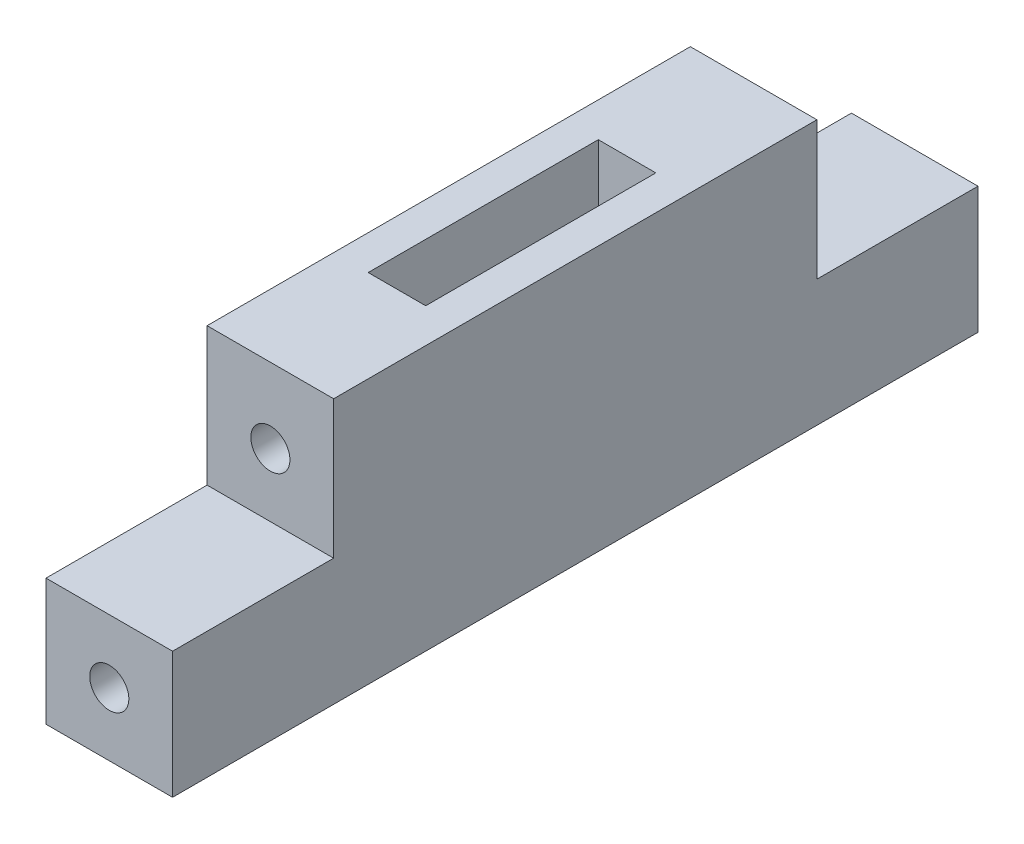
ISO-10303-21;
HEADER;
FILE_DESCRIPTION(('STEP AP214'),'2;1');
FILE_NAME('part.step','',(''),(''),'','','');
FILE_SCHEMA(('AUTOMOTIVE_DESIGN { 1 0 10303 214 1 1 1 1 }'));
ENDSEC;
DATA;
#1=APPLICATION_CONTEXT('core data for automotive mechanical design processes');
#2=APPLICATION_PROTOCOL_DEFINITION('international standard','automotive_design',2000,#1);
#3=PRODUCT_CONTEXT('',#1,'mechanical');
#4=PRODUCT('Part','Part','',(#3));
#5=PRODUCT_RELATED_PRODUCT_CATEGORY('part','',(#4));
#6=PRODUCT_DEFINITION_FORMATION('','',#4);
#7=PRODUCT_DEFINITION_CONTEXT('part definition',#1,'design');
#8=PRODUCT_DEFINITION('design','',#6,#7);
#9=PRODUCT_DEFINITION_SHAPE('','',#8);
#10=(LENGTH_UNIT() NAMED_UNIT(*) SI_UNIT(.MILLI.,.METRE.));
#11=(NAMED_UNIT(*) PLANE_ANGLE_UNIT() SI_UNIT($,.RADIAN.));
#12=(NAMED_UNIT(*) SI_UNIT($,.STERADIAN.) SOLID_ANGLE_UNIT());
#13=UNCERTAINTY_MEASURE_WITH_UNIT(LENGTH_MEASURE(1.E-05),#10,'distance_accuracy_value','');
#14=(GEOMETRIC_REPRESENTATION_CONTEXT(3) GLOBAL_UNCERTAINTY_ASSIGNED_CONTEXT((#13)) GLOBAL_UNIT_ASSIGNED_CONTEXT((#10,
#11,#12)) REPRESENTATION_CONTEXT('',''));
#15=CARTESIAN_POINT('',(0.,0.,0.));
#16=DIRECTION('',(0.,0.,1.));
#17=DIRECTION('',(1.,0.,0.));
#18=AXIS2_PLACEMENT_3D('',#15,#16,#17);
#19=CARTESIAN_POINT('',(0.,11.,85.5563491861041));
#20=DIRECTION('',(0.,-1.,0.));
#21=DIRECTION('',(1.,0.,0.));
#22=AXIS2_PLACEMENT_3D('',#19,#20,#21);
#23=PLANE('',#22);
#24=DIRECTION('',(-1.,0.,0.));
#25=VECTOR('',#24,1.);
#26=CARTESIAN_POINT('',(0.,11.,14.));
#27=LINE('',#26,#25);
#28=CARTESIAN_POINT('',(11.,11.,14.));
#29=VERTEX_POINT('',#28);
#30=CARTESIAN_POINT('',(0.,11.,14.));
#31=VERTEX_POINT('',#30);
#32=EDGE_CURVE('E295',#29,#31,#27,.T.);
#33=ORIENTED_EDGE('',*,*,#32,.F.);
#34=DIRECTION('',(0.,0.,-1.));
#35=VECTOR('',#34,1.);
#36=CARTESIAN_POINT('',(11.,11.,85.5563491861041));
#37=LINE('',#36,#35);
#38=CARTESIAN_POINT('',(11.,11.,0.));
#39=VERTEX_POINT('',#38);
#40=EDGE_CURVE('E356',#29,#39,#37,.T.);
#41=ORIENTED_EDGE('',*,*,#40,.T.);
#42=DIRECTION('',(-1.,0.,0.));
#43=VECTOR('',#42,1.);
#44=CARTESIAN_POINT('',(0.,11.,0.));
#45=LINE('',#44,#43);
#46=CARTESIAN_POINT('',(0.,11.,0.));
#47=VERTEX_POINT('',#46);
#48=EDGE_CURVE('E373',#39,#47,#45,.T.);
#49=ORIENTED_EDGE('',*,*,#48,.T.);
#50=DIRECTION('',(0.,0.,-1.));
#51=VECTOR('',#50,1.);
#52=CARTESIAN_POINT('',(0.,11.,85.5563491861041));
#53=LINE('',#52,#51);
#54=EDGE_CURVE('E369',#31,#47,#53,.T.);
#55=ORIENTED_EDGE('',*,*,#54,.F.);
#56=EDGE_LOOP('',(#33,#41,#49,#55));
#57=FACE_BOUND('',#56,.T.);
#58=ADVANCED_FACE('F37',(#57),#23,.F.);
#59=DIRECTION('',(1.,0.,0.));
#60=VECTOR('',#59,1.);
#61=CARTESIAN_POINT('',(0.,11.,56.));
#62=LINE('',#61,#60);
#63=CARTESIAN_POINT('',(0.,11.,56.));
#64=VERTEX_POINT('',#63);
#65=CARTESIAN_POINT('',(11.,11.,56.));
#66=VERTEX_POINT('',#65);
#67=EDGE_CURVE('E381',#64,#66,#62,.T.);
#68=ORIENTED_EDGE('',*,*,#67,.F.);
#69=CARTESIAN_POINT('',(0.,11.,70.));
#70=VERTEX_POINT('',#69);
#71=EDGE_CURVE('E361',#70,#64,#53,.T.);
#72=ORIENTED_EDGE('',*,*,#71,.F.);
#73=DIRECTION('',(1.,0.,0.));
#74=VECTOR('',#73,1.);
#75=CARTESIAN_POINT('',(0.,11.,70.));
#76=LINE('',#75,#74);
#77=CARTESIAN_POINT('',(11.,11.,70.));
#78=VERTEX_POINT('',#77);
#79=EDGE_CURVE('E344',#70,#78,#76,.T.);
#80=ORIENTED_EDGE('',*,*,#79,.T.);
#81=EDGE_CURVE('E350',#78,#66,#37,.T.);
#82=ORIENTED_EDGE('',*,*,#81,.T.);
#83=EDGE_LOOP('',(#68,#72,#80,#82));
#84=FACE_BOUND('',#83,.T.);
#85=ADVANCED_FACE('F359',(#84),#23,.F.);
#86=CARTESIAN_POINT('',(0.,0.,0.));
#87=DIRECTION('',(0.,0.,-1.));
#88=DIRECTION('',(-1.,0.,0.));
#89=AXIS2_PLACEMENT_3D('',#86,#87,#88);
#90=PLANE('',#89);
#91=CARTESIAN_POINT('',(5.5,5.5,0.));
#92=DIRECTION('',(0.,0.,-1.));
#93=DIRECTION('',(-1.,0.,0.));
#94=AXIS2_PLACEMENT_3D('',#91,#92,#93);
#95=CIRCLE('',#94,1.7);
#96=CARTESIAN_POINT('',(3.8,5.5,0.));
#97=VERTEX_POINT('',#96);
#98=EDGE_CURVE('E316',#97,#97,#95,.T.);
#99=ORIENTED_EDGE('',*,*,#98,.F.);
#100=EDGE_LOOP('',(#99));
#101=FACE_BOUND('',#100,.T.);
#102=DIRECTION('',(0.,-1.,0.));
#103=VECTOR('',#102,1.);
#104=CARTESIAN_POINT('',(0.,0.,0.));
#105=LINE('',#104,#103);
#106=CARTESIAN_POINT('',(0.,0.,0.));
#107=VERTEX_POINT('',#106);
#108=EDGE_CURVE('E414',#47,#107,#105,.T.);
#109=ORIENTED_EDGE('',*,*,#108,.F.);
#110=ORIENTED_EDGE('',*,*,#48,.F.);
#111=DIRECTION('',(0.,1.,0.));
#112=VECTOR('',#111,1.);
#113=CARTESIAN_POINT('',(11.,0.,0.));
#114=LINE('',#113,#112);
#115=CARTESIAN_POINT('',(11.,0.,0.));
#116=VERTEX_POINT('',#115);
#117=EDGE_CURVE('E406',#116,#39,#114,.T.);
#118=ORIENTED_EDGE('',*,*,#117,.F.);
#119=DIRECTION('',(1.,0.,0.));
#120=VECTOR('',#119,1.);
#121=CARTESIAN_POINT('',(0.,0.,0.));
#122=LINE('',#121,#120);
#123=EDGE_CURVE('E411',#107,#116,#122,.T.);
#124=ORIENTED_EDGE('',*,*,#123,.F.);
#125=EDGE_LOOP('',(#109,#110,#118,#124));
#126=FACE_BOUND('',#125,.T.);
#127=ADVANCED_FACE('F413',(#101,#126),#90,.T.);
#128=CARTESIAN_POINT('',(11.,0.,85.5563491861041));
#129=DIRECTION('',(-1.,0.,0.));
#130=DIRECTION('',(0.,0.,1.));
#131=AXIS2_PLACEMENT_3D('',#128,#129,#130);
#132=PLANE('',#131);
#133=ORIENTED_EDGE('',*,*,#81,.F.);
#134=DIRECTION('',(0.,-1.,0.));
#135=VECTOR('',#134,1.);
#136=CARTESIAN_POINT('',(11.,0.,70.));
#137=LINE('',#136,#135);
#138=CARTESIAN_POINT('',(11.,0.,70.));
#139=VERTEX_POINT('',#138);
#140=EDGE_CURVE('E341',#78,#139,#137,.T.);
#141=ORIENTED_EDGE('',*,*,#140,.T.);
#142=DIRECTION('',(0.,0.,-1.));
#143=VECTOR('',#142,1.);
#144=CARTESIAN_POINT('',(11.,0.,85.5563491861041));
#145=LINE('',#144,#143);
#146=EDGE_CURVE('E355',#139,#116,#145,.T.);
#147=ORIENTED_EDGE('',*,*,#146,.T.);
#148=ORIENTED_EDGE('',*,*,#117,.T.);
#149=ORIENTED_EDGE('',*,*,#40,.F.);
#150=DIRECTION('',(0.,-1.,0.));
#151=VECTOR('',#150,1.);
#152=CARTESIAN_POINT('',(11.0000000000001,66.4165866921848,14.));
#153=LINE('',#152,#151);
#154=CARTESIAN_POINT('',(11.,22.9999999999999,14.));
#155=VERTEX_POINT('',#154);
#156=EDGE_CURVE('E300',#155,#29,#153,.T.);
#157=ORIENTED_EDGE('',*,*,#156,.F.);
#158=DIRECTION('',(0.,0.,-1.));
#159=VECTOR('',#158,1.);
#160=CARTESIAN_POINT('',(11.,22.9999999999999,14.0000000000001));
#161=LINE('',#160,#159);
#162=CARTESIAN_POINT('',(11.,23.,56.));
#163=VERTEX_POINT('',#162);
#164=EDGE_CURVE('E415',#163,#155,#161,.T.);
#165=ORIENTED_EDGE('',*,*,#164,.F.);
#166=DIRECTION('',(0.,-1.,0.));
#167=VECTOR('',#166,1.);
#168=CARTESIAN_POINT('',(11.0000000000001,66.4165866921848,56.));
#169=LINE('',#168,#167);
#170=EDGE_CURVE('E305',#163,#66,#169,.T.);
#171=ORIENTED_EDGE('',*,*,#170,.T.);
#172=EDGE_LOOP('',(#133,#141,#147,#148,#149,#157,#165,#171));
#173=FACE_BOUND('',#172,.T.);
#174=ADVANCED_FACE('F351',(#173),#132,.F.);
#175=CARTESIAN_POINT('',(0.,0.,85.5563491861041));
#176=DIRECTION('',(0.,1.,0.));
#177=DIRECTION('',(0.,0.,1.));
#178=AXIS2_PLACEMENT_3D('',#175,#176,#177);
#179=PLANE('',#178);
#180=DIRECTION('',(1.,0.,0.));
#181=VECTOR('',#180,1.);
#182=CARTESIAN_POINT('',(3.,0.,14.));
#183=LINE('',#182,#181);
#184=CARTESIAN_POINT('',(3.,0.,14.));
#185=VERTEX_POINT('',#184);
#186=CARTESIAN_POINT('',(7.99999999999999,0.,14.));
#187=VERTEX_POINT('',#186);
#188=EDGE_CURVE('E208',#185,#187,#183,.T.);
#189=ORIENTED_EDGE('',*,*,#188,.F.);
#190=DIRECTION('',(0.,0.,-1.));
#191=VECTOR('',#190,1.);
#192=CARTESIAN_POINT('',(3.,0.,14.));
#193=LINE('',#192,#191);
#194=CARTESIAN_POINT('',(3.,0.,16.));
#195=VERTEX_POINT('',#194);
#196=EDGE_CURVE('E54',#195,#185,#193,.T.);
#197=ORIENTED_EDGE('',*,*,#196,.F.);
#198=DIRECTION('',(-1.,0.,0.));
#199=VECTOR('',#198,1.);
#200=CARTESIAN_POINT('',(3.,0.,16.));
#201=LINE('',#200,#199);
#202=CARTESIAN_POINT('',(7.99999999999999,0.,16.));
#203=VERTEX_POINT('',#202);
#204=EDGE_CURVE('E196',#203,#195,#201,.T.);
#205=ORIENTED_EDGE('',*,*,#204,.F.);
#206=DIRECTION('',(0.,0.,1.));
#207=VECTOR('',#206,1.);
#208=CARTESIAN_POINT('',(7.99999999999999,0.,14.));
#209=LINE('',#208,#207);
#210=EDGE_CURVE('E199',#187,#203,#209,.T.);
#211=ORIENTED_EDGE('',*,*,#210,.F.);
#212=EDGE_LOOP('',(#189,#197,#205,#211));
#213=FACE_BOUND('',#212,.T.);
#214=DIRECTION('',(1.,0.,0.));
#215=VECTOR('',#214,1.);
#216=CARTESIAN_POINT('',(2.99999999999999,0.,54.));
#217=LINE('',#216,#215);
#218=CARTESIAN_POINT('',(2.99999999999999,0.,54.));
#219=VERTEX_POINT('',#218);
#220=CARTESIAN_POINT('',(7.99999999999999,0.,54.));
#221=VERTEX_POINT('',#220);
#222=EDGE_CURVE('E232',#219,#221,#217,.T.);
#223=ORIENTED_EDGE('',*,*,#222,.F.);
#224=DIRECTION('',(0.,0.,-1.));
#225=VECTOR('',#224,1.);
#226=CARTESIAN_POINT('',(2.99999999999999,0.,56.));
#227=LINE('',#226,#225);
#228=CARTESIAN_POINT('',(2.99999999999999,0.,56.));
#229=VERTEX_POINT('',#228);
#230=EDGE_CURVE('E62',#229,#219,#227,.T.);
#231=ORIENTED_EDGE('',*,*,#230,.F.);
#232=DIRECTION('',(-1.,0.,0.));
#233=VECTOR('',#232,1.);
#234=CARTESIAN_POINT('',(2.99999999999999,0.,56.));
#235=LINE('',#234,#233);
#236=CARTESIAN_POINT('',(7.99999999999999,0.,56.));
#237=VERTEX_POINT('',#236);
#238=EDGE_CURVE('E221',#237,#229,#235,.T.);
#239=ORIENTED_EDGE('',*,*,#238,.F.);
#240=DIRECTION('',(0.,0.,1.));
#241=VECTOR('',#240,1.);
#242=CARTESIAN_POINT('',(7.99999999999999,0.,56.));
#243=LINE('',#242,#241);
#244=EDGE_CURVE('E235',#221,#237,#243,.T.);
#245=ORIENTED_EDGE('',*,*,#244,.F.);
#246=EDGE_LOOP('',(#223,#231,#239,#245));
#247=FACE_BOUND('',#246,.T.);
#248=ORIENTED_EDGE('',*,*,#146,.F.);
#249=DIRECTION('',(-1.,0.,0.));
#250=VECTOR('',#249,1.);
#251=CARTESIAN_POINT('',(0.,0.,70.));
#252=LINE('',#251,#250);
#253=CARTESIAN_POINT('',(0.,0.,70.));
#254=VERTEX_POINT('',#253);
#255=EDGE_CURVE('E46',#139,#254,#252,.T.);
#256=ORIENTED_EDGE('',*,*,#255,.T.);
#257=DIRECTION('',(0.,0.,-1.));
#258=VECTOR('',#257,1.);
#259=CARTESIAN_POINT('',(0.,0.,85.5563491861041));
#260=LINE('',#259,#258);
#261=EDGE_CURVE('E362',#254,#107,#260,.T.);
#262=ORIENTED_EDGE('',*,*,#261,.T.);
#263=ORIENTED_EDGE('',*,*,#123,.T.);
#264=EDGE_LOOP('',(#248,#256,#262,#263));
#265=FACE_BOUND('',#264,.T.);
#266=ADVANCED_FACE('F429',(#213,#247,#265),#179,.F.);
#267=CARTESIAN_POINT('',(0.,0.,85.5563491861041));
#268=DIRECTION('',(1.,0.,0.));
#269=DIRECTION('',(0.,0.,-1.));
#270=AXIS2_PLACEMENT_3D('',#267,#268,#269);
#271=PLANE('',#270);
#272=ORIENTED_EDGE('',*,*,#261,.F.);
#273=DIRECTION('',(0.,1.,0.));
#274=VECTOR('',#273,1.);
#275=CARTESIAN_POINT('',(0.,0.,70.));
#276=LINE('',#275,#274);
#277=EDGE_CURVE('E13',#254,#70,#276,.T.);
#278=ORIENTED_EDGE('',*,*,#277,.T.);
#279=ORIENTED_EDGE('',*,*,#71,.T.);
#280=DIRECTION('',(0.,-1.,0.));
#281=VECTOR('',#280,1.);
#282=CARTESIAN_POINT('',(0.,66.4165866921848,56.));
#283=LINE('',#282,#281);
#284=CARTESIAN_POINT('',(0.,23.,56.));
#285=VERTEX_POINT('',#284);
#286=EDGE_CURVE('E385',#285,#64,#283,.T.);
#287=ORIENTED_EDGE('',*,*,#286,.F.);
#288=DIRECTION('',(0.,0.,1.));
#289=VECTOR('',#288,1.);
#290=CARTESIAN_POINT('',(0.,22.9999999999999,14.0000000000001));
#291=LINE('',#290,#289);
#292=CARTESIAN_POINT('',(0.,22.9999999999999,14.));
#293=VERTEX_POINT('',#292);
#294=EDGE_CURVE('E397',#293,#285,#291,.T.);
#295=ORIENTED_EDGE('',*,*,#294,.F.);
#296=DIRECTION('',(0.,-1.,0.));
#297=VECTOR('',#296,1.);
#298=CARTESIAN_POINT('',(0.,66.4165866921848,14.));
#299=LINE('',#298,#297);
#300=EDGE_CURVE('E283',#293,#31,#299,.T.);
#301=ORIENTED_EDGE('',*,*,#300,.T.);
#302=ORIENTED_EDGE('',*,*,#54,.T.);
#303=ORIENTED_EDGE('',*,*,#108,.T.);
#304=EDGE_LOOP('',(#272,#278,#279,#287,#295,#301,#302,#303));
#305=FACE_BOUND('',#304,.T.);
#306=ADVANCED_FACE('F39',(#305),#271,.F.);
#307=CARTESIAN_POINT('',(0.,31.0464772466386,70.));
#308=DIRECTION('',(0.,0.,-1.));
#309=DIRECTION('',(-1.,0.,0.));
#310=AXIS2_PLACEMENT_3D('',#307,#308,#309);
#311=PLANE('',#310);
#312=CARTESIAN_POINT('',(5.5,5.5,70.));
#313=DIRECTION('',(0.,0.,1.));
#314=DIRECTION('',(1.,0.,0.));
#315=AXIS2_PLACEMENT_3D('',#312,#313,#314);
#316=CIRCLE('',#315,1.7);
#317=CARTESIAN_POINT('',(7.2,5.5,70.));
#318=VERTEX_POINT('',#317);
#319=EDGE_CURVE('E328',#318,#318,#316,.T.);
#320=ORIENTED_EDGE('',*,*,#319,.F.);
#321=EDGE_LOOP('',(#320));
#322=FACE_BOUND('',#321,.T.);
#323=ORIENTED_EDGE('',*,*,#140,.F.);
#324=ORIENTED_EDGE('',*,*,#79,.F.);
#325=ORIENTED_EDGE('',*,*,#277,.F.);
#326=ORIENTED_EDGE('',*,*,#255,.F.);
#327=EDGE_LOOP('',(#323,#324,#325,#326));
#328=FACE_BOUND('',#327,.T.);
#329=ADVANCED_FACE('F335',(#322,#328),#311,.F.);
#330=CARTESIAN_POINT('',(0.,66.4165866921848,56.));
#331=DIRECTION('',(0.,0.,-1.));
#332=DIRECTION('',(-1.,0.,0.));
#333=AXIS2_PLACEMENT_3D('',#330,#331,#332);
#334=PLANE('',#333);
#335=CARTESIAN_POINT('',(5.49999999999999,16.5,56.));
#336=DIRECTION('',(0.,0.,-1.));
#337=DIRECTION('',(-1.,0.,0.));
#338=AXIS2_PLACEMENT_3D('',#335,#336,#337);
#339=CIRCLE('',#338,1.7);
#340=CARTESIAN_POINT('',(3.79999999999999,16.5,56.));
#341=VERTEX_POINT('',#340);
#342=EDGE_CURVE('E250',#341,#341,#339,.F.);
#343=ORIENTED_EDGE('',*,*,#342,.F.);
#344=EDGE_LOOP('',(#343));
#345=FACE_BOUND('',#344,.T.);
#346=DIRECTION('',(1.,0.,0.));
#347=VECTOR('',#346,1.);
#348=CARTESIAN_POINT('',(0.,23.,56.));
#349=LINE('',#348,#347);
#350=EDGE_CURVE('E419',#285,#163,#349,.T.);
#351=ORIENTED_EDGE('',*,*,#350,.F.);
#352=ORIENTED_EDGE('',*,*,#286,.T.);
#353=ORIENTED_EDGE('',*,*,#67,.T.);
#354=ORIENTED_EDGE('',*,*,#170,.F.);
#355=EDGE_LOOP('',(#351,#352,#353,#354));
#356=FACE_BOUND('',#355,.T.);
#357=ADVANCED_FACE('F338',(#345,#356),#334,.F.);
#358=CARTESIAN_POINT('',(0.,66.4165866921848,14.));
#359=DIRECTION('',(0.,0.,1.));
#360=DIRECTION('',(1.,0.,0.));
#361=AXIS2_PLACEMENT_3D('',#358,#359,#360);
#362=PLANE('',#361);
#363=CARTESIAN_POINT('',(5.5,16.5,14.));
#364=DIRECTION('',(0.,0.,-1.));
#365=DIRECTION('',(-1.,0.,0.));
#366=AXIS2_PLACEMENT_3D('',#363,#364,#365);
#367=CIRCLE('',#366,1.7);
#368=CARTESIAN_POINT('',(3.8,16.5,14.));
#369=VERTEX_POINT('',#368);
#370=EDGE_CURVE('E242',#369,#369,#367,.T.);
#371=ORIENTED_EDGE('',*,*,#370,.F.);
#372=EDGE_LOOP('',(#371));
#373=FACE_BOUND('',#372,.T.);
#374=DIRECTION('',(-1.,0.,0.));
#375=VECTOR('',#374,1.);
#376=CARTESIAN_POINT('',(0.,22.9999999999999,14.));
#377=LINE('',#376,#375);
#378=EDGE_CURVE('E299',#155,#293,#377,.T.);
#379=ORIENTED_EDGE('',*,*,#378,.F.);
#380=ORIENTED_EDGE('',*,*,#156,.T.);
#381=ORIENTED_EDGE('',*,*,#32,.T.);
#382=ORIENTED_EDGE('',*,*,#300,.F.);
#383=EDGE_LOOP('',(#379,#380,#381,#382));
#384=FACE_BOUND('',#383,.T.);
#385=ADVANCED_FACE('F401',(#373,#384),#362,.F.);
#386=CARTESIAN_POINT('',(-23.2214772466387,22.9999999999999,14.));
#387=DIRECTION('',(0.,1.,0.));
#388=DIRECTION('',(0.,0.,-1.));
#389=AXIS2_PLACEMENT_3D('',#386,#387,#388);
#390=PLANE('',#389);
#391=DIRECTION('',(0.,0.,-1.));
#392=VECTOR('',#391,1.);
#393=CARTESIAN_POINT('',(7.99999999999999,22.9999999999999,25.));
#394=LINE('',#393,#392);
#395=CARTESIAN_POINT('',(8.,23.,45.));
#396=VERTEX_POINT('',#395);
#397=CARTESIAN_POINT('',(7.99999999999999,22.9999999999999,25.));
#398=VERTEX_POINT('',#397);
#399=EDGE_CURVE('E257',#396,#398,#394,.T.);
#400=ORIENTED_EDGE('',*,*,#399,.F.);
#401=DIRECTION('',(1.,0.,0.));
#402=VECTOR('',#401,1.);
#403=CARTESIAN_POINT('',(8.,23.,45.));
#404=LINE('',#403,#402);
#405=CARTESIAN_POINT('',(3.,23.,45.));
#406=VERTEX_POINT('',#405);
#407=EDGE_CURVE('E262',#406,#396,#404,.T.);
#408=ORIENTED_EDGE('',*,*,#407,.F.);
#409=DIRECTION('',(0.,0.,1.));
#410=VECTOR('',#409,1.);
#411=CARTESIAN_POINT('',(3.,22.9999999999999,25.));
#412=LINE('',#411,#410);
#413=CARTESIAN_POINT('',(3.,22.9999999999999,25.));
#414=VERTEX_POINT('',#413);
#415=EDGE_CURVE('E276',#414,#406,#412,.T.);
#416=ORIENTED_EDGE('',*,*,#415,.F.);
#417=DIRECTION('',(-1.,0.,0.));
#418=VECTOR('',#417,1.);
#419=CARTESIAN_POINT('',(7.99999999999999,22.9999999999999,25.));
#420=LINE('',#419,#418);
#421=EDGE_CURVE('E273',#398,#414,#420,.T.);
#422=ORIENTED_EDGE('',*,*,#421,.F.);
#423=EDGE_LOOP('',(#400,#408,#416,#422));
#424=FACE_BOUND('',#423,.T.);
#425=ORIENTED_EDGE('',*,*,#378,.T.);
#426=ORIENTED_EDGE('',*,*,#294,.T.);
#427=ORIENTED_EDGE('',*,*,#350,.T.);
#428=ORIENTED_EDGE('',*,*,#164,.T.);
#429=EDGE_LOOP('',(#425,#426,#427,#428));
#430=FACE_BOUND('',#429,.T.);
#431=ADVANCED_FACE('F426',(#424,#430),#390,.T.);
#432=CARTESIAN_POINT('',(7.99999999999999,12.9999999999999,25.));
#433=DIRECTION('',(1.,0.,0.));
#434=DIRECTION('',(0.,1.,0.));
#435=AXIS2_PLACEMENT_3D('',#432,#433,#434);
#436=PLANE('',#435);
#437=ORIENTED_EDGE('',*,*,#399,.T.);
#438=DIRECTION('',(0.,1.,0.));
#439=VECTOR('',#438,1.);
#440=CARTESIAN_POINT('',(7.99999999999999,12.9999999999999,25.));
#441=LINE('',#440,#439);
#442=CARTESIAN_POINT('',(7.99999999999999,12.9999999999999,25.));
#443=VERTEX_POINT('',#442);
#444=EDGE_CURVE('E271',#443,#398,#441,.T.);
#445=ORIENTED_EDGE('',*,*,#444,.F.);
#446=DIRECTION('',(0.,0.,-1.));
#447=VECTOR('',#446,1.);
#448=CARTESIAN_POINT('',(7.99999999999999,12.9999999999999,25.));
#449=LINE('',#448,#447);
#450=CARTESIAN_POINT('',(7.99999999999999,13.,45.));
#451=VERTEX_POINT('',#450);
#452=EDGE_CURVE('E258',#451,#443,#449,.T.);
#453=ORIENTED_EDGE('',*,*,#452,.F.);
#454=DIRECTION('',(0.,1.,0.));
#455=VECTOR('',#454,1.);
#456=CARTESIAN_POINT('',(7.99999999999999,13.,45.));
#457=LINE('',#456,#455);
#458=EDGE_CURVE('E281',#451,#396,#457,.T.);
#459=ORIENTED_EDGE('',*,*,#458,.T.);
#460=EDGE_LOOP('',(#437,#445,#453,#459));
#461=FACE_BOUND('',#460,.T.);
#462=ADVANCED_FACE('F449',(#461),#436,.F.);
#463=CARTESIAN_POINT('',(7.99999999999999,13.,45.));
#464=DIRECTION('',(0.,0.,1.));
#465=DIRECTION('',(0.,-1.,0.));
#466=AXIS2_PLACEMENT_3D('',#463,#464,#465);
#467=PLANE('',#466);
#468=CARTESIAN_POINT('',(5.49999999999999,16.5,45.));
#469=DIRECTION('',(0.,0.,1.));
#470=DIRECTION('',(0.,-1.,0.));
#471=AXIS2_PLACEMENT_3D('',#468,#469,#470);
#472=CIRCLE('',#471,1.7);
#473=CARTESIAN_POINT('',(5.49999999999999,14.8,45.));
#474=VERTEX_POINT('',#473);
#475=EDGE_CURVE('E254',#474,#474,#472,.T.);
#476=ORIENTED_EDGE('',*,*,#475,.T.);
#477=EDGE_LOOP('',(#476));
#478=FACE_BOUND('',#477,.T.);
#479=ORIENTED_EDGE('',*,*,#407,.T.);
#480=ORIENTED_EDGE('',*,*,#458,.F.);
#481=DIRECTION('',(1.,0.,0.));
#482=VECTOR('',#481,1.);
#483=CARTESIAN_POINT('',(7.99999999999999,13.,45.));
#484=LINE('',#483,#482);
#485=CARTESIAN_POINT('',(3.,13.,45.));
#486=VERTEX_POINT('',#485);
#487=EDGE_CURVE('E268',#486,#451,#484,.T.);
#488=ORIENTED_EDGE('',*,*,#487,.F.);
#489=DIRECTION('',(0.,1.,0.));
#490=VECTOR('',#489,1.);
#491=CARTESIAN_POINT('',(3.,13.,45.));
#492=LINE('',#491,#490);
#493=EDGE_CURVE('E284',#486,#406,#492,.T.);
#494=ORIENTED_EDGE('',*,*,#493,.T.);
#495=EDGE_LOOP('',(#479,#480,#488,#494));
#496=FACE_BOUND('',#495,.T.);
#497=ADVANCED_FACE('F459',(#478,#496),#467,.F.);
#498=CARTESIAN_POINT('',(3.,12.9999999999999,25.));
#499=DIRECTION('',(-1.,0.,0.));
#500=DIRECTION('',(0.,0.,1.));
#501=AXIS2_PLACEMENT_3D('',#498,#499,#500);
#502=PLANE('',#501);
#503=ORIENTED_EDGE('',*,*,#415,.T.);
#504=ORIENTED_EDGE('',*,*,#493,.F.);
#505=DIRECTION('',(0.,0.,1.));
#506=VECTOR('',#505,1.);
#507=CARTESIAN_POINT('',(3.,12.9999999999999,25.));
#508=LINE('',#507,#506);
#509=CARTESIAN_POINT('',(3.,12.9999999999999,25.));
#510=VERTEX_POINT('',#509);
#511=EDGE_CURVE('E265',#510,#486,#508,.T.);
#512=ORIENTED_EDGE('',*,*,#511,.F.);
#513=DIRECTION('',(0.,1.,0.));
#514=VECTOR('',#513,1.);
#515=CARTESIAN_POINT('',(3.,12.9999999999999,25.));
#516=LINE('',#515,#514);
#517=EDGE_CURVE('E286',#510,#414,#516,.T.);
#518=ORIENTED_EDGE('',*,*,#517,.T.);
#519=EDGE_LOOP('',(#503,#504,#512,#518));
#520=FACE_BOUND('',#519,.T.);
#521=ADVANCED_FACE('F465',(#520),#502,.F.);
#522=CARTESIAN_POINT('',(7.99999999999999,12.9999999999999,25.));
#523=DIRECTION('',(0.,0.,-1.));
#524=DIRECTION('',(0.,1.,0.));
#525=AXIS2_PLACEMENT_3D('',#522,#523,#524);
#526=PLANE('',#525);
#527=CARTESIAN_POINT('',(5.49999999999999,16.5,25.));
#528=DIRECTION('',(0.,0.,-1.));
#529=DIRECTION('',(0.,1.,0.));
#530=AXIS2_PLACEMENT_3D('',#527,#528,#529);
#531=CIRCLE('',#530,1.7);
#532=CARTESIAN_POINT('',(5.49999999999999,18.2,25.));
#533=VERTEX_POINT('',#532);
#534=EDGE_CURVE('E253',#533,#533,#531,.T.);
#535=ORIENTED_EDGE('',*,*,#534,.T.);
#536=EDGE_LOOP('',(#535));
#537=FACE_BOUND('',#536,.T.);
#538=ORIENTED_EDGE('',*,*,#421,.T.);
#539=ORIENTED_EDGE('',*,*,#517,.F.);
#540=DIRECTION('',(-1.,0.,0.));
#541=VECTOR('',#540,1.);
#542=CARTESIAN_POINT('',(7.99999999999999,12.9999999999999,25.));
#543=LINE('',#542,#541);
#544=EDGE_CURVE('E261',#443,#510,#543,.T.);
#545=ORIENTED_EDGE('',*,*,#544,.F.);
#546=ORIENTED_EDGE('',*,*,#444,.T.);
#547=EDGE_LOOP('',(#538,#539,#545,#546));
#548=FACE_BOUND('',#547,.T.);
#549=ADVANCED_FACE('F461',(#537,#548),#526,.F.);
#550=CARTESIAN_POINT('',(0.,12.9999999999999,0.));
#551=DIRECTION('',(0.,-1.,0.));
#552=DIRECTION('',(0.,0.,-1.));
#553=AXIS2_PLACEMENT_3D('',#550,#551,#552);
#554=PLANE('',#553);
#555=ORIENTED_EDGE('',*,*,#452,.T.);
#556=ORIENTED_EDGE('',*,*,#544,.T.);
#557=ORIENTED_EDGE('',*,*,#511,.T.);
#558=ORIENTED_EDGE('',*,*,#487,.T.);
#559=EDGE_LOOP('',(#555,#556,#557,#558));
#560=FACE_BOUND('',#559,.T.);
#561=ADVANCED_FACE('F464',(#560),#554,.F.);
#562=CARTESIAN_POINT('',(5.49999999999999,16.5,60.8083261120685));
#563=DIRECTION('',(0.,0.,-1.));
#564=DIRECTION('',(-1.,0.,0.));
#565=AXIS2_PLACEMENT_3D('',#562,#563,#564);
#566=CYLINDRICAL_SURFACE('',#565,1.7);
#567=ORIENTED_EDGE('',*,*,#370,.T.);
#568=EDGE_LOOP('',(#567));
#569=FACE_BOUND('',#568,.T.);
#570=ORIENTED_EDGE('',*,*,#534,.F.);
#571=EDGE_LOOP('',(#570));
#572=FACE_BOUND('',#571,.T.);
#573=ADVANCED_FACE('F475',(#569,#572),#566,.F.);
#574=ORIENTED_EDGE('',*,*,#342,.T.);
#575=EDGE_LOOP('',(#574));
#576=FACE_BOUND('',#575,.T.);
#577=ORIENTED_EDGE('',*,*,#475,.F.);
#578=EDGE_LOOP('',(#577));
#579=FACE_BOUND('',#578,.T.);
#580=ADVANCED_FACE('F477',(#576,#579),#566,.F.);
#581=CARTESIAN_POINT('',(2.99999999999999,8.,56.));
#582=DIRECTION('',(-1.,0.,0.));
#583=DIRECTION('',(0.,0.,1.));
#584=AXIS2_PLACEMENT_3D('',#581,#582,#583);
#585=PLANE('',#584);
#586=ORIENTED_EDGE('',*,*,#230,.T.);
#587=DIRECTION('',(0.,-1.,0.));
#588=VECTOR('',#587,1.);
#589=CARTESIAN_POINT('',(2.99999999999999,8.,54.));
#590=LINE('',#589,#588);
#591=CARTESIAN_POINT('',(2.99999999999999,8.,54.));
#592=VERTEX_POINT('',#591);
#593=EDGE_CURVE('E230',#592,#219,#590,.T.);
#594=ORIENTED_EDGE('',*,*,#593,.F.);
#595=DIRECTION('',(0.,0.,-1.));
#596=VECTOR('',#595,1.);
#597=CARTESIAN_POINT('',(2.99999999999999,8.,56.));
#598=LINE('',#597,#596);
#599=CARTESIAN_POINT('',(2.99999999999999,8.,56.));
#600=VERTEX_POINT('',#599);
#601=EDGE_CURVE('E217',#600,#592,#598,.T.);
#602=ORIENTED_EDGE('',*,*,#601,.F.);
#603=DIRECTION('',(0.,-1.,0.));
#604=VECTOR('',#603,1.);
#605=CARTESIAN_POINT('',(2.99999999999999,8.,56.));
#606=LINE('',#605,#604);
#607=EDGE_CURVE('E240',#600,#229,#606,.T.);
#608=ORIENTED_EDGE('',*,*,#607,.T.);
#609=EDGE_LOOP('',(#586,#594,#602,#608));
#610=FACE_BOUND('',#609,.T.);
#611=ADVANCED_FACE('F480',(#610),#585,.F.);
#612=CARTESIAN_POINT('',(2.99999999999999,8.,56.));
#613=DIRECTION('',(0.,0.,1.));
#614=DIRECTION('',(1.,0.,0.));
#615=AXIS2_PLACEMENT_3D('',#612,#613,#614);
#616=PLANE('',#615);
#617=CARTESIAN_POINT('',(5.5,5.5,56.));
#618=DIRECTION('',(0.,0.,1.));
#619=DIRECTION('',(1.,0.,0.));
#620=AXIS2_PLACEMENT_3D('',#617,#618,#619);
#621=CIRCLE('',#620,1.7);
#622=CARTESIAN_POINT('',(7.2,5.5,56.));
#623=VERTEX_POINT('',#622);
#624=EDGE_CURVE('E320',#623,#623,#621,.T.);
#625=ORIENTED_EDGE('',*,*,#624,.T.);
#626=EDGE_LOOP('',(#625));
#627=FACE_BOUND('',#626,.T.);
#628=ORIENTED_EDGE('',*,*,#238,.T.);
#629=ORIENTED_EDGE('',*,*,#607,.F.);
#630=DIRECTION('',(-1.,0.,0.));
#631=VECTOR('',#630,1.);
#632=CARTESIAN_POINT('',(2.99999999999999,8.,56.));
#633=LINE('',#632,#631);
#634=CARTESIAN_POINT('',(7.99999999999999,8.,56.));
#635=VERTEX_POINT('',#634);
#636=EDGE_CURVE('E227',#635,#600,#633,.T.);
#637=ORIENTED_EDGE('',*,*,#636,.F.);
#638=DIRECTION('',(0.,-1.,0.));
#639=VECTOR('',#638,1.);
#640=CARTESIAN_POINT('',(7.99999999999999,8.,56.));
#641=LINE('',#640,#639);
#642=EDGE_CURVE('E243',#635,#237,#641,.T.);
#643=ORIENTED_EDGE('',*,*,#642,.T.);
#644=EDGE_LOOP('',(#628,#629,#637,#643));
#645=FACE_BOUND('',#644,.T.);
#646=ADVANCED_FACE('F484',(#627,#645),#616,.F.);
#647=CARTESIAN_POINT('',(7.99999999999999,8.,56.));
#648=DIRECTION('',(1.,0.,0.));
#649=DIRECTION('',(0.,0.,-1.));
#650=AXIS2_PLACEMENT_3D('',#647,#648,#649);
#651=PLANE('',#650);
#652=ORIENTED_EDGE('',*,*,#244,.T.);
#653=ORIENTED_EDGE('',*,*,#642,.F.);
#654=DIRECTION('',(0.,0.,1.));
#655=VECTOR('',#654,1.);
#656=CARTESIAN_POINT('',(7.99999999999999,8.,56.));
#657=LINE('',#656,#655);
#658=CARTESIAN_POINT('',(7.99999999999999,8.,54.));
#659=VERTEX_POINT('',#658);
#660=EDGE_CURVE('E224',#659,#635,#657,.T.);
#661=ORIENTED_EDGE('',*,*,#660,.F.);
#662=DIRECTION('',(0.,-1.,0.));
#663=VECTOR('',#662,1.);
#664=CARTESIAN_POINT('',(7.99999999999999,8.,54.));
#665=LINE('',#664,#663);
#666=EDGE_CURVE('E245',#659,#221,#665,.T.);
#667=ORIENTED_EDGE('',*,*,#666,.T.);
#668=EDGE_LOOP('',(#652,#653,#661,#667));
#669=FACE_BOUND('',#668,.T.);
#670=ADVANCED_FACE('F489',(#669),#651,.F.);
#671=CARTESIAN_POINT('',(2.99999999999999,8.,54.));
#672=DIRECTION('',(0.,0.,-1.));
#673=DIRECTION('',(-1.,0.,0.));
#674=AXIS2_PLACEMENT_3D('',#671,#672,#673);
#675=PLANE('',#674);
#676=CARTESIAN_POINT('',(5.5,5.5,54.));
#677=DIRECTION('',(0.,0.,-1.));
#678=DIRECTION('',(-1.,0.,0.));
#679=AXIS2_PLACEMENT_3D('',#676,#677,#678);
#680=CIRCLE('',#679,1.7);
#681=CARTESIAN_POINT('',(7.2,5.5,54.));
#682=VERTEX_POINT('',#681);
#683=EDGE_CURVE('E41',#682,#682,#680,.T.);
#684=ORIENTED_EDGE('',*,*,#683,.T.);
#685=EDGE_LOOP('',(#684));
#686=FACE_BOUND('',#685,.T.);
#687=ORIENTED_EDGE('',*,*,#222,.T.);
#688=ORIENTED_EDGE('',*,*,#666,.F.);
#689=DIRECTION('',(1.,0.,0.));
#690=VECTOR('',#689,1.);
#691=CARTESIAN_POINT('',(2.99999999999999,8.,54.));
#692=LINE('',#691,#690);
#693=EDGE_CURVE('E220',#592,#659,#692,.T.);
#694=ORIENTED_EDGE('',*,*,#693,.F.);
#695=ORIENTED_EDGE('',*,*,#593,.T.);
#696=EDGE_LOOP('',(#687,#688,#694,#695));
#697=FACE_BOUND('',#696,.T.);
#698=ADVANCED_FACE('F485',(#686,#697),#675,.F.);
#699=CARTESIAN_POINT('',(0.,8.,0.));
#700=DIRECTION('',(0.,-1.,0.));
#701=DIRECTION('',(0.,0.,-1.));
#702=AXIS2_PLACEMENT_3D('',#699,#700,#701);
#703=PLANE('',#702);
#704=ORIENTED_EDGE('',*,*,#601,.T.);
#705=ORIENTED_EDGE('',*,*,#693,.T.);
#706=ORIENTED_EDGE('',*,*,#660,.T.);
#707=ORIENTED_EDGE('',*,*,#636,.T.);
#708=EDGE_LOOP('',(#704,#705,#706,#707));
#709=FACE_BOUND('',#708,.T.);
#710=ADVANCED_FACE('F488',(#709),#703,.T.);
#711=CARTESIAN_POINT('',(3.,8.,14.));
#712=DIRECTION('',(-1.,0.,0.));
#713=DIRECTION('',(0.,0.,1.));
#714=AXIS2_PLACEMENT_3D('',#711,#712,#713);
#715=PLANE('',#714);
#716=ORIENTED_EDGE('',*,*,#196,.T.);
#717=DIRECTION('',(0.,-1.,0.));
#718=VECTOR('',#717,1.);
#719=CARTESIAN_POINT('',(3.,8.,14.));
#720=LINE('',#719,#718);
#721=CARTESIAN_POINT('',(3.,8.,14.));
#722=VERTEX_POINT('',#721);
#723=EDGE_CURVE('E174',#722,#185,#720,.T.);
#724=ORIENTED_EDGE('',*,*,#723,.F.);
#725=DIRECTION('',(0.,0.,-1.));
#726=VECTOR('',#725,1.);
#727=CARTESIAN_POINT('',(3.,8.,14.));
#728=LINE('',#727,#726);
#729=CARTESIAN_POINT('',(3.,8.,16.));
#730=VERTEX_POINT('',#729);
#731=EDGE_CURVE('E178',#730,#722,#728,.T.);
#732=ORIENTED_EDGE('',*,*,#731,.F.);
#733=DIRECTION('',(0.,-1.,0.));
#734=VECTOR('',#733,1.);
#735=CARTESIAN_POINT('',(3.,8.,16.));
#736=LINE('',#735,#734);
#737=EDGE_CURVE('E212',#730,#195,#736,.T.);
#738=ORIENTED_EDGE('',*,*,#737,.T.);
#739=EDGE_LOOP('',(#716,#724,#732,#738));
#740=FACE_BOUND('',#739,.T.);
#741=ADVANCED_FACE('F176',(#740),#715,.F.);
#742=CARTESIAN_POINT('',(3.,8.,16.));
#743=DIRECTION('',(0.,0.,1.));
#744=DIRECTION('',(1.,0.,0.));
#745=AXIS2_PLACEMENT_3D('',#742,#743,#744);
#746=PLANE('',#745);
#747=CARTESIAN_POINT('',(5.5,5.5,16.));
#748=DIRECTION('',(0.,0.,1.));
#749=DIRECTION('',(1.,0.,0.));
#750=AXIS2_PLACEMENT_3D('',#747,#748,#749);
#751=CIRCLE('',#750,1.7);
#752=CARTESIAN_POINT('',(7.2,5.5,16.));
#753=VERTEX_POINT('',#752);
#754=EDGE_CURVE('E202',#753,#753,#751,.T.);
#755=ORIENTED_EDGE('',*,*,#754,.T.);
#756=EDGE_LOOP('',(#755));
#757=FACE_BOUND('',#756,.T.);
#758=ORIENTED_EDGE('',*,*,#204,.T.);
#759=ORIENTED_EDGE('',*,*,#737,.F.);
#760=DIRECTION('',(-1.,0.,0.));
#761=VECTOR('',#760,1.);
#762=CARTESIAN_POINT('',(3.,8.,16.));
#763=LINE('',#762,#761);
#764=CARTESIAN_POINT('',(7.99999999999999,8.,16.));
#765=VERTEX_POINT('',#764);
#766=EDGE_CURVE('E184',#765,#730,#763,.T.);
#767=ORIENTED_EDGE('',*,*,#766,.F.);
#768=DIRECTION('',(0.,-1.,0.));
#769=VECTOR('',#768,1.);
#770=CARTESIAN_POINT('',(7.99999999999999,8.,16.));
#771=LINE('',#770,#769);
#772=EDGE_CURVE('E214',#765,#203,#771,.T.);
#773=ORIENTED_EDGE('',*,*,#772,.T.);
#774=EDGE_LOOP('',(#758,#759,#767,#773));
#775=FACE_BOUND('',#774,.T.);
#776=ADVANCED_FACE('F502',(#757,#775),#746,.F.);
#777=CARTESIAN_POINT('',(7.99999999999999,8.,14.));
#778=DIRECTION('',(1.,0.,0.));
#779=DIRECTION('',(0.,0.,-1.));
#780=AXIS2_PLACEMENT_3D('',#777,#778,#779);
#781=PLANE('',#780);
#782=ORIENTED_EDGE('',*,*,#210,.T.);
#783=ORIENTED_EDGE('',*,*,#772,.F.);
#784=DIRECTION('',(0.,0.,1.));
#785=VECTOR('',#784,1.);
#786=CARTESIAN_POINT('',(7.99999999999999,8.,14.));
#787=LINE('',#786,#785);
#788=CARTESIAN_POINT('',(7.99999999999999,8.,14.));
#789=VERTEX_POINT('',#788);
#790=EDGE_CURVE('E192',#789,#765,#787,.T.);
#791=ORIENTED_EDGE('',*,*,#790,.F.);
#792=DIRECTION('',(0.,-1.,0.));
#793=VECTOR('',#792,1.);
#794=CARTESIAN_POINT('',(7.99999999999999,8.,14.));
#795=LINE('',#794,#793);
#796=EDGE_CURVE('E183',#789,#187,#795,.T.);
#797=ORIENTED_EDGE('',*,*,#796,.T.);
#798=EDGE_LOOP('',(#782,#783,#791,#797));
#799=FACE_BOUND('',#798,.T.);
#800=ADVANCED_FACE('F505',(#799),#781,.F.);
#801=CARTESIAN_POINT('',(3.,8.,14.));
#802=DIRECTION('',(0.,0.,-1.));
#803=DIRECTION('',(-1.,0.,0.));
#804=AXIS2_PLACEMENT_3D('',#801,#802,#803);
#805=PLANE('',#804);
#806=CARTESIAN_POINT('',(5.5,5.5,14.));
#807=DIRECTION('',(0.,0.,-1.));
#808=DIRECTION('',(-1.,0.,0.));
#809=AXIS2_PLACEMENT_3D('',#806,#807,#808);
#810=CIRCLE('',#809,1.7);
#811=CARTESIAN_POINT('',(3.8,5.5,14.));
#812=VERTEX_POINT('',#811);
#813=EDGE_CURVE('E309',#812,#812,#810,.T.);
#814=ORIENTED_EDGE('',*,*,#813,.T.);
#815=EDGE_LOOP('',(#814));
#816=FACE_BOUND('',#815,.T.);
#817=ORIENTED_EDGE('',*,*,#188,.T.);
#818=ORIENTED_EDGE('',*,*,#796,.F.);
#819=DIRECTION('',(1.,0.,0.));
#820=VECTOR('',#819,1.);
#821=CARTESIAN_POINT('',(3.,8.,14.));
#822=LINE('',#821,#820);
#823=EDGE_CURVE('E187',#722,#789,#822,.T.);
#824=ORIENTED_EDGE('',*,*,#823,.F.);
#825=ORIENTED_EDGE('',*,*,#723,.T.);
#826=EDGE_LOOP('',(#817,#818,#824,#825));
#827=FACE_BOUND('',#826,.T.);
#828=ADVANCED_FACE('F188',(#816,#827),#805,.F.);
#829=CARTESIAN_POINT('',(0.,8.,0.));
#830=DIRECTION('',(0.,1.,0.));
#831=DIRECTION('',(0.,0.,1.));
#832=AXIS2_PLACEMENT_3D('',#829,#830,#831);
#833=PLANE('',#832);
#834=ORIENTED_EDGE('',*,*,#731,.T.);
#835=ORIENTED_EDGE('',*,*,#823,.T.);
#836=ORIENTED_EDGE('',*,*,#790,.T.);
#837=ORIENTED_EDGE('',*,*,#766,.T.);
#838=EDGE_LOOP('',(#834,#835,#836,#837));
#839=FACE_BOUND('',#838,.T.);
#840=ADVANCED_FACE('F194',(#839),#833,.F.);
#841=CARTESIAN_POINT('',(5.5,5.5,22.8083261120685));
#842=DIRECTION('',(0.,0.,-1.));
#843=DIRECTION('',(-1.,0.,0.));
#844=AXIS2_PLACEMENT_3D('',#841,#842,#843);
#845=CYLINDRICAL_SURFACE('',#844,1.7);
#846=ORIENTED_EDGE('',*,*,#98,.T.);
#847=EDGE_LOOP('',(#846));
#848=FACE_BOUND('',#847,.T.);
#849=ORIENTED_EDGE('',*,*,#813,.F.);
#850=EDGE_LOOP('',(#849));
#851=FACE_BOUND('',#850,.T.);
#852=ADVANCED_FACE('F514',(#848,#851),#845,.F.);
#853=CARTESIAN_POINT('',(5.5,5.5,17.));
#854=DIRECTION('',(0.,0.,1.));
#855=DIRECTION('',(1.,0.,0.));
#856=AXIS2_PLACEMENT_3D('',#853,#854,#855);
#857=CIRCLE('',#856,1.7);
#858=CARTESIAN_POINT('',(7.2,5.5,17.));
#859=VERTEX_POINT('',#858);
#860=EDGE_CURVE('E311',#859,#859,#857,.F.);
#861=ORIENTED_EDGE('',*,*,#860,.F.);
#862=EDGE_LOOP('',(#861));
#863=FACE_BOUND('',#862,.T.);
#864=ORIENTED_EDGE('',*,*,#754,.F.);
#865=EDGE_LOOP('',(#864));
#866=FACE_BOUND('',#865,.T.);
#867=ADVANCED_FACE('F519',(#863,#866),#845,.F.);
#868=CARTESIAN_POINT('',(3.,8.,17.));
#869=DIRECTION('',(0.,0.,1.));
#870=DIRECTION('',(1.,0.,0.));
#871=AXIS2_PLACEMENT_3D('',#868,#869,#870);
#872=PLANE('',#871);
#873=ORIENTED_EDGE('',*,*,#860,.T.);
#874=EDGE_LOOP('',(#873));
#875=FACE_BOUND('',#874,.T.);
#876=ADVANCED_FACE('F515',(#875),#872,.F.);
#877=CARTESIAN_POINT('',(2.99999999999999,8.,53.));
#878=DIRECTION('',(0.,0.,-1.));
#879=DIRECTION('',(-1.,0.,0.));
#880=AXIS2_PLACEMENT_3D('',#877,#878,#879);
#881=PLANE('',#880);
#882=CARTESIAN_POINT('',(5.5,5.5,53.));
#883=DIRECTION('',(0.,0.,-1.));
#884=DIRECTION('',(-1.,0.,0.));
#885=AXIS2_PLACEMENT_3D('',#882,#883,#884);
#886=CIRCLE('',#885,1.7);
#887=CARTESIAN_POINT('',(7.2,5.5,53.));
#888=VERTEX_POINT('',#887);
#889=EDGE_CURVE('E325',#888,#888,#886,.F.);
#890=ORIENTED_EDGE('',*,*,#889,.T.);
#891=EDGE_LOOP('',(#890));
#892=FACE_BOUND('',#891,.T.);
#893=ADVANCED_FACE('F518',(#892),#881,.F.);
#894=CARTESIAN_POINT('',(5.5,5.5,47.1916738879315));
#895=DIRECTION('',(0.,0.,1.));
#896=DIRECTION('',(1.,0.,0.));
#897=AXIS2_PLACEMENT_3D('',#894,#895,#896);
#898=CYLINDRICAL_SURFACE('',#897,1.7);
#899=CARTESIAN_POINT('',(7.2,5.5,53.));
#900=CARTESIAN_POINT('',(7.2,5.5,53.0104166666667));
#901=CARTESIAN_POINT('',(7.2,5.5,53.0208333333334));
#902=CARTESIAN_POINT('',(7.2,5.5,53.0416666666667));
#903=CARTESIAN_POINT('',(7.2,5.5,53.0520833333334));
#904=CARTESIAN_POINT('',(7.2,5.5,53.0729166666667));
#905=CARTESIAN_POINT('',(7.2,5.5,53.0833333333334));
#906=CARTESIAN_POINT('',(7.2,5.5,53.1041666666667));
#907=CARTESIAN_POINT('',(7.2,5.5,53.1145833333334));
#908=CARTESIAN_POINT('',(7.2,5.5,53.1354166666667));
#909=CARTESIAN_POINT('',(7.2,5.5,53.1458333333334));
#910=CARTESIAN_POINT('',(7.2,5.5,53.1666666666667));
#911=CARTESIAN_POINT('',(7.2,5.5,53.1770833333334));
#912=CARTESIAN_POINT('',(7.2,5.5,53.1979166666667));
#913=CARTESIAN_POINT('',(7.2,5.5,53.2083333333334));
#914=CARTESIAN_POINT('',(7.2,5.5,53.2291666666667));
#915=CARTESIAN_POINT('',(7.2,5.5,53.2395833333334));
#916=CARTESIAN_POINT('',(7.2,5.5,53.2604166666667));
#917=CARTESIAN_POINT('',(7.2,5.5,53.2708333333334));
#918=CARTESIAN_POINT('',(7.2,5.5,53.2916666666667));
#919=CARTESIAN_POINT('',(7.2,5.5,53.3020833333334));
#920=CARTESIAN_POINT('',(7.2,5.5,53.3229166666667));
#921=CARTESIAN_POINT('',(7.2,5.5,53.3333333333334));
#922=CARTESIAN_POINT('',(7.2,5.5,53.3541666666667));
#923=CARTESIAN_POINT('',(7.2,5.5,53.3645833333334));
#924=CARTESIAN_POINT('',(7.2,5.5,53.3854166666667));
#925=CARTESIAN_POINT('',(7.2,5.5,53.3958333333334));
#926=CARTESIAN_POINT('',(7.2,5.5,53.4166666666667));
#927=CARTESIAN_POINT('',(7.2,5.5,53.4270833333334));
#928=CARTESIAN_POINT('',(7.2,5.5,53.4479166666667));
#929=CARTESIAN_POINT('',(7.2,5.5,53.4583333333334));
#930=CARTESIAN_POINT('',(7.2,5.5,53.4791666666667));
#931=CARTESIAN_POINT('',(7.2,5.5,53.4895833333334));
#932=CARTESIAN_POINT('',(7.2,5.5,53.5104166666667));
#933=CARTESIAN_POINT('',(7.2,5.5,53.5208333333334));
#934=CARTESIAN_POINT('',(7.2,5.5,53.5416666666667));
#935=CARTESIAN_POINT('',(7.2,5.5,53.5520833333334));
#936=CARTESIAN_POINT('',(7.2,5.5,53.5729166666667));
#937=CARTESIAN_POINT('',(7.2,5.5,53.5833333333334));
#938=CARTESIAN_POINT('',(7.2,5.5,53.6041666666667));
#939=CARTESIAN_POINT('',(7.2,5.5,53.6145833333334));
#940=CARTESIAN_POINT('',(7.2,5.5,53.6354166666667));
#941=CARTESIAN_POINT('',(7.2,5.5,53.6458333333334));
#942=CARTESIAN_POINT('',(7.2,5.5,53.6666666666667));
#943=CARTESIAN_POINT('',(7.2,5.5,53.6770833333334));
#944=CARTESIAN_POINT('',(7.2,5.5,53.6979166666667));
#945=CARTESIAN_POINT('',(7.2,5.5,53.7083333333334));
#946=CARTESIAN_POINT('',(7.2,5.5,53.7291666666667));
#947=CARTESIAN_POINT('',(7.2,5.5,53.7395833333334));
#948=CARTESIAN_POINT('',(7.2,5.5,53.7604166666667));
#949=CARTESIAN_POINT('',(7.2,5.5,53.7708333333334));
#950=CARTESIAN_POINT('',(7.2,5.5,53.7916666666667));
#951=CARTESIAN_POINT('',(7.2,5.5,53.8020833333334));
#952=CARTESIAN_POINT('',(7.2,5.5,53.8229166666667));
#953=CARTESIAN_POINT('',(7.2,5.5,53.8333333333334));
#954=CARTESIAN_POINT('',(7.2,5.5,53.8541666666667));
#955=CARTESIAN_POINT('',(7.2,5.5,53.8645833333334));
#956=CARTESIAN_POINT('',(7.2,5.5,53.8854166666667));
#957=CARTESIAN_POINT('',(7.2,5.5,53.8958333333334));
#958=CARTESIAN_POINT('',(7.2,5.5,53.9166666666667));
#959=CARTESIAN_POINT('',(7.2,5.5,53.9270833333334));
#960=CARTESIAN_POINT('',(7.2,5.5,53.9479166666667));
#961=CARTESIAN_POINT('',(7.2,5.5,53.9583333333334));
#962=CARTESIAN_POINT('',(7.2,5.5,53.9791666666667));
#963=CARTESIAN_POINT('',(7.2,5.5,53.9895833333334));
#964=CARTESIAN_POINT('',(7.2,5.5,54.));
#965=B_SPLINE_CURVE_WITH_KNOTS('',3,(#899,#900,#901,#902,#903,#904,#905,#906,#907,#908,#909,
#910,#911,#912,#913,#914,#915,#916,#917,#918,#919,#920,#921,#922,#923,#924,#925,#926,#927,#928,
#929,#930,#931,#932,#933,#934,#935,#936,#937,#938,#939,#940,#941,#942,#943,#944,#945,#946,#947,
#948,#949,#950,#951,#952,#953,#954,#955,#956,#957,#958,#959,#960,#961,#962,#963,#964),
.UNSPECIFIED.,.F.,.F.,(4,2,2,2,2,2,2,2,2,2,2,2,2,2,2,2,2,2,2,2,2,2,2,2,2,2,2,2,2,2,2,2,4),(0.,
0.0312499999999966,0.0625000000000001,0.0937499999999966,0.125,0.156249999999997,0.1875,
0.218749999999997,0.25,0.281249999999997,0.3125,0.343749999999997,0.375,0.406249999999997,
0.4375,0.468749999999997,0.5,0.531249999999997,0.5625,0.593749999999997,0.625000000000001,
0.656249999999997,0.687500000000001,0.718749999999997,0.750000000000001,0.781249999999997,
0.812500000000001,0.843749999999997,0.875000000000001,0.906249999999997,0.937500000000001,
0.968749999999997,1.),.UNSPECIFIED.);
#966=EDGE_CURVE('BSEAM525',#888,#682,#965,.T.);
#967=ORIENTED_EDGE('',*,*,#889,.F.);
#968=ORIENTED_EDGE('',*,*,#683,.F.);
#969=ORIENTED_EDGE('',*,*,#966,.T.);
#970=ORIENTED_EDGE('',*,*,#966,.F.);
#971=EDGE_LOOP('',(#967,#969,#968,#970));
#972=FACE_BOUND('',#971,.T.);
#973=ADVANCED_FACE('F525',(#972),#898,.F.);
#974=CARTESIAN_POINT('',(7.2,5.5,70.));
#975=CARTESIAN_POINT('',(7.2,5.5,69.8541666666667));
#976=CARTESIAN_POINT('',(7.2,5.5,69.7083333333333));
#977=CARTESIAN_POINT('',(7.2,5.5,69.4166666666667));
#978=CARTESIAN_POINT('',(7.2,5.5,69.2708333333333));
#979=CARTESIAN_POINT('',(7.2,5.5,68.9791666666667));
#980=CARTESIAN_POINT('',(7.2,5.5,68.8333333333333));
#981=CARTESIAN_POINT('',(7.2,5.5,68.5416666666667));
#982=CARTESIAN_POINT('',(7.2,5.5,68.3958333333333));
#983=CARTESIAN_POINT('',(7.2,5.5,68.1041666666667));
#984=CARTESIAN_POINT('',(7.2,5.5,67.9583333333333));
#985=CARTESIAN_POINT('',(7.2,5.5,67.6666666666667));
#986=CARTESIAN_POINT('',(7.2,5.5,67.5208333333333));
#987=CARTESIAN_POINT('',(7.2,5.5,67.2291666666667));
#988=CARTESIAN_POINT('',(7.2,5.5,67.0833333333333));
#989=CARTESIAN_POINT('',(7.2,5.5,66.7916666666667));
#990=CARTESIAN_POINT('',(7.2,5.5,66.6458333333333));
#991=CARTESIAN_POINT('',(7.2,5.5,66.3541666666667));
#992=CARTESIAN_POINT('',(7.2,5.5,66.2083333333333));
#993=CARTESIAN_POINT('',(7.2,5.5,65.9166666666667));
#994=CARTESIAN_POINT('',(7.2,5.5,65.7708333333333));
#995=CARTESIAN_POINT('',(7.2,5.5,65.4791666666667));
#996=CARTESIAN_POINT('',(7.2,5.5,65.3333333333333));
#997=CARTESIAN_POINT('',(7.2,5.5,65.0416666666667));
#998=CARTESIAN_POINT('',(7.2,5.5,64.8958333333333));
#999=CARTESIAN_POINT('',(7.2,5.5,64.6041666666667));
#1000=CARTESIAN_POINT('',(7.2,5.5,64.4583333333333));
#1001=CARTESIAN_POINT('',(7.2,5.5,64.1666666666667));
#1002=CARTESIAN_POINT('',(7.2,5.5,64.0208333333333));
#1003=CARTESIAN_POINT('',(7.2,5.5,63.7291666666667));
#1004=CARTESIAN_POINT('',(7.2,5.5,63.5833333333333));
#1005=CARTESIAN_POINT('',(7.2,5.5,63.2916666666667));
#1006=CARTESIAN_POINT('',(7.2,5.5,63.1458333333333));
#1007=CARTESIAN_POINT('',(7.2,5.5,62.8541666666667));
#1008=CARTESIAN_POINT('',(7.2,5.5,62.7083333333333));
#1009=CARTESIAN_POINT('',(7.2,5.5,62.4166666666667));
#1010=CARTESIAN_POINT('',(7.2,5.5,62.2708333333333));
#1011=CARTESIAN_POINT('',(7.2,5.5,61.9791666666667));
#1012=CARTESIAN_POINT('',(7.2,5.5,61.8333333333333));
#1013=CARTESIAN_POINT('',(7.2,5.5,61.5416666666667));
#1014=CARTESIAN_POINT('',(7.2,5.5,61.3958333333333));
#1015=CARTESIAN_POINT('',(7.2,5.5,61.1041666666667));
#1016=CARTESIAN_POINT('',(7.2,5.5,60.9583333333333));
#1017=CARTESIAN_POINT('',(7.2,5.5,60.6666666666667));
#1018=CARTESIAN_POINT('',(7.2,5.5,60.5208333333333));
#1019=CARTESIAN_POINT('',(7.2,5.5,60.2291666666667));
#1020=CARTESIAN_POINT('',(7.2,5.5,60.0833333333333));
#1021=CARTESIAN_POINT('',(7.2,5.5,59.7916666666667));
#1022=CARTESIAN_POINT('',(7.2,5.5,59.6458333333333));
#1023=CARTESIAN_POINT('',(7.2,5.5,59.3541666666667));
#1024=CARTESIAN_POINT('',(7.2,5.5,59.2083333333333));
#1025=CARTESIAN_POINT('',(7.2,5.5,58.9166666666667));
#1026=CARTESIAN_POINT('',(7.2,5.5,58.7708333333333));
#1027=CARTESIAN_POINT('',(7.2,5.5,58.4791666666667));
#1028=CARTESIAN_POINT('',(7.2,5.5,58.3333333333333));
#1029=CARTESIAN_POINT('',(7.2,5.5,58.0416666666667));
#1030=CARTESIAN_POINT('',(7.2,5.5,57.8958333333333));
#1031=CARTESIAN_POINT('',(7.2,5.5,57.6041666666667));
#1032=CARTESIAN_POINT('',(7.2,5.5,57.4583333333333));
#1033=CARTESIAN_POINT('',(7.2,5.5,57.1666666666667));
#1034=CARTESIAN_POINT('',(7.2,5.5,57.0208333333333));
#1035=CARTESIAN_POINT('',(7.2,5.5,56.7291666666667));
#1036=CARTESIAN_POINT('',(7.2,5.5,56.5833333333333));
#1037=CARTESIAN_POINT('',(7.2,5.5,56.2916666666667));
#1038=CARTESIAN_POINT('',(7.2,5.5,56.1458333333333));
#1039=CARTESIAN_POINT('',(7.2,5.5,56.));
#1040=B_SPLINE_CURVE_WITH_KNOTS('',3,(#974,#975,#976,#977,#978,#979,#980,#981,#982,#983,#984,
#985,#986,#987,#988,#989,#990,#991,#992,#993,#994,#995,#996,#997,#998,#999,#1000,#1001,#1002,
#1003,#1004,#1005,#1006,#1007,#1008,#1009,#1010,#1011,#1012,#1013,#1014,#1015,#1016,#1017,#1018,
#1019,#1020,#1021,#1022,#1023,#1024,#1025,#1026,#1027,#1028,#1029,#1030,#1031,#1032,#1033,#1034,
#1035,#1036,#1037,#1038,#1039),.UNSPECIFIED.,.F.,.F.,(4,2,2,2,2,2,2,2,2,2,2,2,2,2,2,2,2,2,2,2,2,
2,2,2,2,2,2,2,2,2,2,2,4),(0.,0.437499999999993,0.875000000000001,1.31249999999999,
1.74999999999999,2.1875,2.62499999999999,3.0625,3.49999999999999,3.9375,4.37499999999999,
4.81249999999998,5.24999999999999,5.68749999999998,6.12499999999999,6.56249999999998,
6.99999999999999,7.43749999999999,7.87499999999999,8.31249999999999,8.74999999999998,
9.18749999999998,9.62499999999998,10.0625,10.5,10.9375,11.375,11.8125,12.25,12.6875,13.125,
13.5625,14.),.UNSPECIFIED.);
#1041=EDGE_CURVE('BSEAM332',#318,#623,#1040,.T.);
#1042=ORIENTED_EDGE('',*,*,#319,.T.);
#1043=ORIENTED_EDGE('',*,*,#624,.F.);
#1044=ORIENTED_EDGE('',*,*,#1041,.T.);
#1045=ORIENTED_EDGE('',*,*,#1041,.F.);
#1046=EDGE_LOOP('',(#1042,#1044,#1043,#1045));
#1047=FACE_BOUND('',#1046,.T.);
#1048=ADVANCED_FACE('F332',(#1047),#898,.F.);
#1049=CLOSED_SHELL('',(#58,#85,#127,#174,#266,#306,#329,#357,#385,#431,#462,#497,#521,#549,#561,
#573,#580,#611,#646,#670,#698,#710,#741,#776,#800,#828,#840,#852,#867,#876,#893,#973,#1048));
#1050=MANIFOLD_SOLID_BREP('B2',#1049);
#1051=ADVANCED_BREP_SHAPE_REPRESENTATION('',(#18,#1050),#14);
#1052=SHAPE_DEFINITION_REPRESENTATION(#9,#1051);
ENDSEC;
END-ISO-10303-21;
